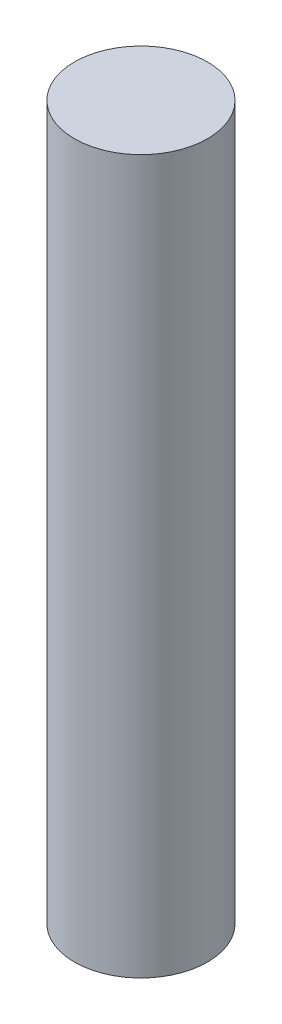
ISO-10303-21;
HEADER;
FILE_DESCRIPTION(('STEP AP214'),'2;1');
FILE_NAME('part.step','',(''),(''),'','','');
FILE_SCHEMA(('AUTOMOTIVE_DESIGN { 1 0 10303 214 1 1 1 1 }'));
ENDSEC;
DATA;
#1=APPLICATION_CONTEXT('core data for automotive mechanical design processes');
#2=APPLICATION_PROTOCOL_DEFINITION('international standard','automotive_design',2000,#1);
#3=PRODUCT_CONTEXT('',#1,'mechanical');
#4=PRODUCT('Part','Part','',(#3));
#5=PRODUCT_RELATED_PRODUCT_CATEGORY('part','',(#4));
#6=PRODUCT_DEFINITION_FORMATION('','',#4);
#7=PRODUCT_DEFINITION_CONTEXT('part definition',#1,'design');
#8=PRODUCT_DEFINITION('design','',#6,#7);
#9=PRODUCT_DEFINITION_SHAPE('','',#8);
#10=(LENGTH_UNIT() NAMED_UNIT(*) SI_UNIT(.MILLI.,.METRE.));
#11=(NAMED_UNIT(*) PLANE_ANGLE_UNIT() SI_UNIT($,.RADIAN.));
#12=(NAMED_UNIT(*) SI_UNIT($,.STERADIAN.) SOLID_ANGLE_UNIT());
#13=UNCERTAINTY_MEASURE_WITH_UNIT(LENGTH_MEASURE(1.E-05),#10,'distance_accuracy_value','');
#14=(GEOMETRIC_REPRESENTATION_CONTEXT(3) GLOBAL_UNCERTAINTY_ASSIGNED_CONTEXT((#13)) GLOBAL_UNIT_ASSIGNED_CONTEXT((#10,
#11,#12)) REPRESENTATION_CONTEXT('',''));
#15=CARTESIAN_POINT('',(0.,0.,0.));
#16=DIRECTION('',(0.,0.,1.));
#17=DIRECTION('',(1.,0.,0.));
#18=AXIS2_PLACEMENT_3D('',#15,#16,#17);
#19=CARTESIAN_POINT('',(0.,114.3,0.));
#20=DIRECTION('',(0.,-1.,0.));
#21=DIRECTION('',(0.,0.,-1.));
#22=AXIS2_PLACEMENT_3D('',#19,#20,#21);
#23=CYLINDRICAL_SURFACE('',#22,10.668);
#24=CARTESIAN_POINT('',(0.,114.3,0.));
#25=DIRECTION('',(0.,1.,0.));
#26=DIRECTION('',(0.,0.,1.));
#27=AXIS2_PLACEMENT_3D('',#24,#25,#26);
#28=CIRCLE('',#27,10.668);
#29=CARTESIAN_POINT('',(0.,114.3,10.668));
#30=VERTEX_POINT('',#29);
#31=EDGE_CURVE('E10',#30,#30,#28,.T.);
#32=ORIENTED_EDGE('',*,*,#31,.F.);
#33=EDGE_LOOP('',(#32));
#34=FACE_BOUND('',#33,.T.);
#35=CARTESIAN_POINT('',(0.,0.,0.));
#36=DIRECTION('',(0.,1.,0.));
#37=DIRECTION('',(0.,0.,1.));
#38=AXIS2_PLACEMENT_3D('',#35,#36,#37);
#39=CIRCLE('',#38,10.668);
#40=CARTESIAN_POINT('',(0.,0.,10.668));
#41=VERTEX_POINT('',#40);
#42=EDGE_CURVE('E33',#41,#41,#39,.T.);
#43=ORIENTED_EDGE('',*,*,#42,.T.);
#44=EDGE_LOOP('',(#43));
#45=FACE_BOUND('',#44,.T.);
#46=ADVANCED_FACE('F30',(#34,#45),#23,.T.);
#47=CARTESIAN_POINT('',(0.,114.3,0.));
#48=DIRECTION('',(0.,1.,0.));
#49=DIRECTION('',(0.,0.,1.));
#50=AXIS2_PLACEMENT_3D('',#47,#48,#49);
#51=PLANE('',#50);
#52=ORIENTED_EDGE('',*,*,#31,.T.);
#53=EDGE_LOOP('',(#52));
#54=FACE_BOUND('',#53,.T.);
#55=ADVANCED_FACE('F45',(#54),#51,.T.);
#56=CARTESIAN_POINT('',(0.,0.,0.));
#57=DIRECTION('',(0.,1.,0.));
#58=DIRECTION('',(0.,0.,1.));
#59=AXIS2_PLACEMENT_3D('',#56,#57,#58);
#60=PLANE('',#59);
#61=ORIENTED_EDGE('',*,*,#42,.F.);
#62=EDGE_LOOP('',(#61));
#63=FACE_BOUND('',#62,.T.);
#64=ADVANCED_FACE('F43',(#63),#60,.F.);
#65=CLOSED_SHELL('',(#46,#55,#64));
#66=MANIFOLD_SOLID_BREP('B2',#65);
#67=ADVANCED_BREP_SHAPE_REPRESENTATION('',(#18,#66),#14);
#68=SHAPE_DEFINITION_REPRESENTATION(#9,#67);
ENDSEC;
END-ISO-10303-21;
